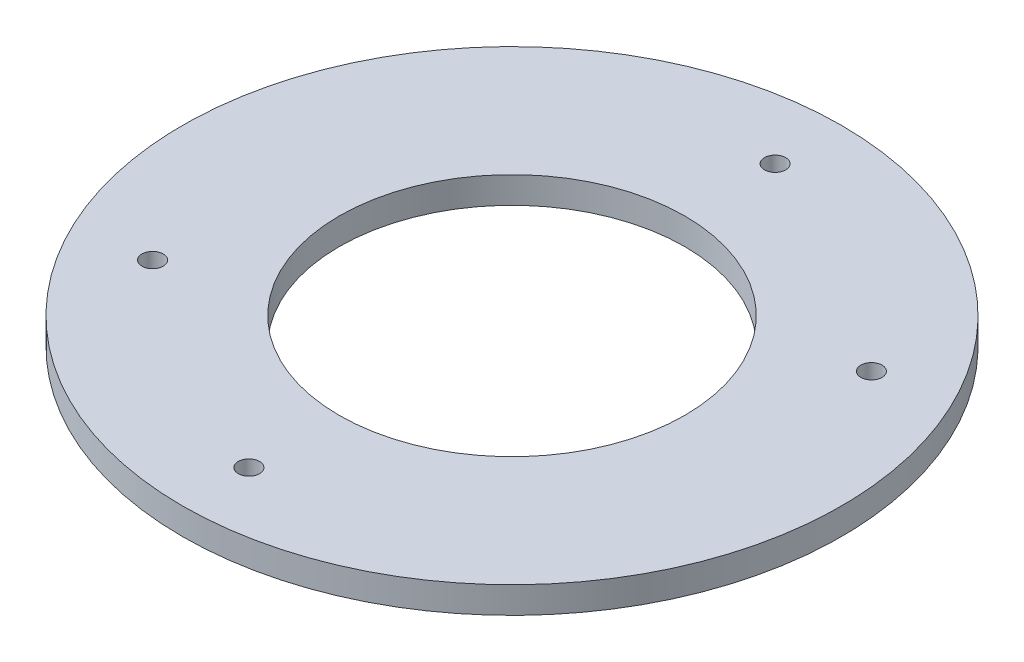
ISO-10303-21;
HEADER;
FILE_DESCRIPTION(('STEP AP214'),'2;1');
FILE_NAME('part.step','',(''),(''),'','','');
FILE_SCHEMA(('AUTOMOTIVE_DESIGN { 1 0 10303 214 1 1 1 1 }'));
ENDSEC;
DATA;
#1=APPLICATION_CONTEXT('core data for automotive mechanical design processes');
#2=APPLICATION_PROTOCOL_DEFINITION('international standard','automotive_design',2000,#1);
#3=PRODUCT_CONTEXT('',#1,'mechanical');
#4=PRODUCT('Part','Part','',(#3));
#5=PRODUCT_RELATED_PRODUCT_CATEGORY('part','',(#4));
#6=PRODUCT_DEFINITION_FORMATION('','',#4);
#7=PRODUCT_DEFINITION_CONTEXT('part definition',#1,'design');
#8=PRODUCT_DEFINITION('design','',#6,#7);
#9=PRODUCT_DEFINITION_SHAPE('','',#8);
#10=(LENGTH_UNIT() NAMED_UNIT(*) SI_UNIT(.MILLI.,.METRE.));
#11=(NAMED_UNIT(*) PLANE_ANGLE_UNIT() SI_UNIT($,.RADIAN.));
#12=(NAMED_UNIT(*) SI_UNIT($,.STERADIAN.) SOLID_ANGLE_UNIT());
#13=UNCERTAINTY_MEASURE_WITH_UNIT(LENGTH_MEASURE(1.E-05),#10,'distance_accuracy_value','');
#14=(GEOMETRIC_REPRESENTATION_CONTEXT(3) GLOBAL_UNCERTAINTY_ASSIGNED_CONTEXT((#13)) GLOBAL_UNIT_ASSIGNED_CONTEXT((#10,
#11,#12)) REPRESENTATION_CONTEXT('',''));
#15=CARTESIAN_POINT('',(0.,0.,0.));
#16=DIRECTION('',(0.,0.,1.));
#17=DIRECTION('',(1.,0.,0.));
#18=AXIS2_PLACEMENT_3D('',#15,#16,#17);
#19=CARTESIAN_POINT('',(0.,5.,0.));
#20=DIRECTION('',(0.,-1.,0.));
#21=DIRECTION('',(0.,0.,-1.));
#22=AXIS2_PLACEMENT_3D('',#19,#20,#21);
#23=CYLINDRICAL_SURFACE('',#22,62.);
#24=CARTESIAN_POINT('',(0.,5.,0.));
#25=DIRECTION('',(0.,1.,0.));
#26=DIRECTION('',(0.,0.,1.));
#27=AXIS2_PLACEMENT_3D('',#24,#25,#26);
#28=CIRCLE('',#27,62.);
#29=CARTESIAN_POINT('',(0.,5.,62.));
#30=VERTEX_POINT('',#29);
#31=EDGE_CURVE('E10',#30,#30,#28,.T.);
#32=ORIENTED_EDGE('',*,*,#31,.F.);
#33=EDGE_LOOP('',(#32));
#34=FACE_BOUND('',#33,.T.);
#35=CARTESIAN_POINT('',(0.,0.,0.));
#36=DIRECTION('',(0.,1.,0.));
#37=DIRECTION('',(0.,0.,1.));
#38=AXIS2_PLACEMENT_3D('',#35,#36,#37);
#39=CIRCLE('',#38,62.);
#40=CARTESIAN_POINT('',(0.,0.,62.));
#41=VERTEX_POINT('',#40);
#42=EDGE_CURVE('E39',#41,#41,#39,.T.);
#43=ORIENTED_EDGE('',*,*,#42,.T.);
#44=EDGE_LOOP('',(#43));
#45=FACE_BOUND('',#44,.T.);
#46=ADVANCED_FACE('F36',(#34,#45),#23,.T.);
#47=CARTESIAN_POINT('',(0.,5.,0.));
#48=DIRECTION('',(0.,1.,0.));
#49=DIRECTION('',(0.,0.,1.));
#50=AXIS2_PLACEMENT_3D('',#47,#48,#49);
#51=PLANE('',#50);
#52=CARTESIAN_POINT('',(0.,5.,0.));
#53=DIRECTION('',(0.,1.,0.));
#54=DIRECTION('',(0.,0.,1.));
#55=AXIS2_PLACEMENT_3D('',#52,#53,#54);
#56=CIRCLE('',#55,32.5);
#57=CARTESIAN_POINT('',(0.,5.,32.5));
#58=VERTEX_POINT('',#57);
#59=EDGE_CURVE('E69',#58,#58,#56,.T.);
#60=ORIENTED_EDGE('',*,*,#59,.F.);
#61=EDGE_LOOP('',(#60));
#62=FACE_BOUND('',#61,.T.);
#63=CARTESIAN_POINT('',(0.,5.,49.5));
#64=DIRECTION('',(0.,-1.,0.));
#65=DIRECTION('',(0.,0.,-1.));
#66=AXIS2_PLACEMENT_3D('',#63,#64,#65);
#67=CIRCLE('',#66,2.);
#68=CARTESIAN_POINT('',(0.,5.,47.5));
#69=VERTEX_POINT('',#68);
#70=EDGE_CURVE('E66',#69,#69,#67,.T.);
#71=ORIENTED_EDGE('',*,*,#70,.T.);
#72=EDGE_LOOP('',(#71));
#73=FACE_BOUND('',#72,.T.);
#74=CARTESIAN_POINT('',(42.8682574873296,5.,-24.7500000000002));
#75=DIRECTION('',(0.,-1.,0.));
#76=DIRECTION('',(-0.866025403784436,0.,0.500000000000004));
#77=AXIS2_PLACEMENT_3D('',#74,#75,#76);
#78=CIRCLE('',#77,2.);
#79=CARTESIAN_POINT('',(41.1362066797607,5.,-23.7500000000002));
#80=VERTEX_POINT('',#79);
#81=EDGE_CURVE('E60',#80,#80,#78,.T.);
#82=ORIENTED_EDGE('',*,*,#81,.T.);
#83=EDGE_LOOP('',(#82));
#84=FACE_BOUND('',#83,.T.);
#85=CARTESIAN_POINT('',(-42.8682574873296,5.,24.7500000000002));
#86=DIRECTION('',(0.,1.,0.));
#87=DIRECTION('',(0.866025403784436,0.,-0.500000000000004));
#88=AXIS2_PLACEMENT_3D('',#85,#86,#87);
#89=CIRCLE('',#88,2.);
#90=CARTESIAN_POINT('',(-41.1362066797607,5.,23.7500000000002));
#91=VERTEX_POINT('',#90);
#92=EDGE_CURVE('E54',#91,#91,#89,.T.);
#93=ORIENTED_EDGE('',*,*,#92,.F.);
#94=EDGE_LOOP('',(#93));
#95=FACE_BOUND('',#94,.T.);
#96=CARTESIAN_POINT('',(0.,5.,-49.5));
#97=DIRECTION('',(0.,1.,0.));
#98=DIRECTION('',(0.,0.,1.));
#99=AXIS2_PLACEMENT_3D('',#96,#97,#98);
#100=CIRCLE('',#99,2.);
#101=CARTESIAN_POINT('',(0.,5.,-47.5));
#102=VERTEX_POINT('',#101);
#103=EDGE_CURVE('E48',#102,#102,#100,.T.);
#104=ORIENTED_EDGE('',*,*,#103,.F.);
#105=EDGE_LOOP('',(#104));
#106=FACE_BOUND('',#105,.T.);
#107=ORIENTED_EDGE('',*,*,#31,.T.);
#108=EDGE_LOOP('',(#107));
#109=FACE_BOUND('',#108,.T.);
#110=ADVANCED_FACE('F84',(#62,#73,#84,#95,#106,#109),#51,.T.);
#111=CARTESIAN_POINT('',(0.,0.,0.));
#112=DIRECTION('',(0.,1.,0.));
#113=DIRECTION('',(0.,0.,1.));
#114=AXIS2_PLACEMENT_3D('',#111,#112,#113);
#115=PLANE('',#114);
#116=CARTESIAN_POINT('',(0.,0.,0.));
#117=DIRECTION('',(0.,-1.,0.));
#118=DIRECTION('',(0.,0.,-1.));
#119=AXIS2_PLACEMENT_3D('',#116,#117,#118);
#120=CIRCLE('',#119,32.5);
#121=CARTESIAN_POINT('',(0.,0.,-32.5));
#122=VERTEX_POINT('',#121);
#123=EDGE_CURVE('E74',#122,#122,#120,.T.);
#124=ORIENTED_EDGE('',*,*,#123,.F.);
#125=EDGE_LOOP('',(#124));
#126=FACE_BOUND('',#125,.T.);
#127=CARTESIAN_POINT('',(0.,0.,49.5));
#128=DIRECTION('',(0.,-1.,0.));
#129=DIRECTION('',(0.,0.,-1.));
#130=AXIS2_PLACEMENT_3D('',#127,#128,#129);
#131=CIRCLE('',#130,2.);
#132=CARTESIAN_POINT('',(0.,0.,47.5));
#133=VERTEX_POINT('',#132);
#134=EDGE_CURVE('E63',#133,#133,#131,.T.);
#135=ORIENTED_EDGE('',*,*,#134,.F.);
#136=EDGE_LOOP('',(#135));
#137=FACE_BOUND('',#136,.T.);
#138=CARTESIAN_POINT('',(42.8682574873296,0.,-24.7500000000002));
#139=DIRECTION('',(0.,-1.,0.));
#140=DIRECTION('',(-0.866025403784436,0.,0.500000000000004));
#141=AXIS2_PLACEMENT_3D('',#138,#139,#140);
#142=CIRCLE('',#141,2.);
#143=CARTESIAN_POINT('',(41.1362066797607,0.,-23.7500000000002));
#144=VERTEX_POINT('',#143);
#145=EDGE_CURVE('E57',#144,#144,#142,.T.);
#146=ORIENTED_EDGE('',*,*,#145,.F.);
#147=EDGE_LOOP('',(#146));
#148=FACE_BOUND('',#147,.T.);
#149=CARTESIAN_POINT('',(-42.8682574873296,0.,24.7500000000002));
#150=DIRECTION('',(0.,1.,0.));
#151=DIRECTION('',(0.866025403784436,0.,-0.500000000000004));
#152=AXIS2_PLACEMENT_3D('',#149,#150,#151);
#153=CIRCLE('',#152,2.);
#154=CARTESIAN_POINT('',(-41.1362066797607,0.,23.7500000000002));
#155=VERTEX_POINT('',#154);
#156=EDGE_CURVE('E51',#155,#155,#153,.T.);
#157=ORIENTED_EDGE('',*,*,#156,.T.);
#158=EDGE_LOOP('',(#157));
#159=FACE_BOUND('',#158,.T.);
#160=CARTESIAN_POINT('',(0.,0.,-49.5));
#161=DIRECTION('',(0.,1.,0.));
#162=DIRECTION('',(0.,0.,1.));
#163=AXIS2_PLACEMENT_3D('',#160,#161,#162);
#164=CIRCLE('',#163,2.);
#165=CARTESIAN_POINT('',(0.,0.,-47.5));
#166=VERTEX_POINT('',#165);
#167=EDGE_CURVE('E46',#166,#166,#164,.T.);
#168=ORIENTED_EDGE('',*,*,#167,.T.);
#169=EDGE_LOOP('',(#168));
#170=FACE_BOUND('',#169,.T.);
#171=ORIENTED_EDGE('',*,*,#42,.F.);
#172=EDGE_LOOP('',(#171));
#173=FACE_BOUND('',#172,.T.);
#174=ADVANCED_FACE('F80',(#126,#137,#148,#159,#170,#173),#115,.F.);
#175=CARTESIAN_POINT('',(0.,0.,-49.5));
#176=DIRECTION('',(0.,1.,0.));
#177=DIRECTION('',(0.,0.,1.));
#178=AXIS2_PLACEMENT_3D('',#175,#176,#177);
#179=CYLINDRICAL_SURFACE('',#178,2.);
#180=ORIENTED_EDGE('',*,*,#167,.F.);
#181=EDGE_LOOP('',(#180));
#182=FACE_BOUND('',#181,.T.);
#183=ORIENTED_EDGE('',*,*,#103,.T.);
#184=EDGE_LOOP('',(#183));
#185=FACE_BOUND('',#184,.T.);
#186=ADVANCED_FACE('F83',(#182,#185),#179,.F.);
#187=CARTESIAN_POINT('',(-42.8682574873296,0.,24.7500000000002));
#188=DIRECTION('',(0.,1.,0.));
#189=DIRECTION('',(0.,0.,1.));
#190=AXIS2_PLACEMENT_3D('',#187,#188,#189);
#191=CYLINDRICAL_SURFACE('',#190,2.);
#192=ORIENTED_EDGE('',*,*,#156,.F.);
#193=EDGE_LOOP('',(#192));
#194=FACE_BOUND('',#193,.T.);
#195=ORIENTED_EDGE('',*,*,#92,.T.);
#196=EDGE_LOOP('',(#195));
#197=FACE_BOUND('',#196,.T.);
#198=ADVANCED_FACE('F109',(#194,#197),#191,.F.);
#199=CARTESIAN_POINT('',(42.8682574873296,0.,-24.7500000000002));
#200=DIRECTION('',(0.,1.,0.));
#201=DIRECTION('',(0.,0.,1.));
#202=AXIS2_PLACEMENT_3D('',#199,#200,#201);
#203=CYLINDRICAL_SURFACE('',#202,2.);
#204=ORIENTED_EDGE('',*,*,#145,.T.);
#205=EDGE_LOOP('',(#204));
#206=FACE_BOUND('',#205,.T.);
#207=ORIENTED_EDGE('',*,*,#81,.F.);
#208=EDGE_LOOP('',(#207));
#209=FACE_BOUND('',#208,.T.);
#210=ADVANCED_FACE('F113',(#206,#209),#203,.F.);
#211=CARTESIAN_POINT('',(0.,0.,49.5));
#212=DIRECTION('',(0.,1.,0.));
#213=DIRECTION('',(0.,0.,1.));
#214=AXIS2_PLACEMENT_3D('',#211,#212,#213);
#215=CYLINDRICAL_SURFACE('',#214,2.);
#216=ORIENTED_EDGE('',*,*,#134,.T.);
#217=EDGE_LOOP('',(#216));
#218=FACE_BOUND('',#217,.T.);
#219=ORIENTED_EDGE('',*,*,#70,.F.);
#220=EDGE_LOOP('',(#219));
#221=FACE_BOUND('',#220,.T.);
#222=ADVANCED_FACE('F117',(#218,#221),#215,.F.);
#223=CARTESIAN_POINT('',(0.,10.,0.));
#224=DIRECTION('',(0.,-1.,0.));
#225=DIRECTION('',(0.,0.,-1.));
#226=AXIS2_PLACEMENT_3D('',#223,#224,#225);
#227=CYLINDRICAL_SURFACE('',#226,32.5);
#228=ORIENTED_EDGE('',*,*,#59,.T.);
#229=EDGE_LOOP('',(#228));
#230=FACE_BOUND('',#229,.T.);
#231=ORIENTED_EDGE('',*,*,#123,.T.);
#232=EDGE_LOOP('',(#231));
#233=FACE_BOUND('',#232,.T.);
#234=ADVANCED_FACE('F78',(#230,#233),#227,.F.);
#235=CLOSED_SHELL('',(#46,#110,#174,#186,#198,#210,#222,#234));
#236=MANIFOLD_SOLID_BREP('B2',#235);
#237=ADVANCED_BREP_SHAPE_REPRESENTATION('',(#18,#236),#14);
#238=SHAPE_DEFINITION_REPRESENTATION(#9,#237);
ENDSEC;
END-ISO-10303-21;
